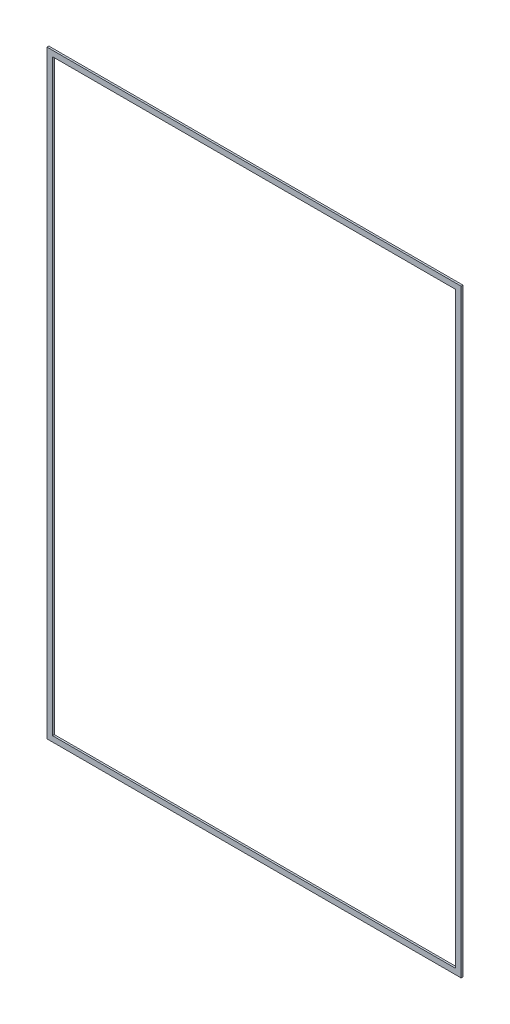
ISO-10303-21;
HEADER;
FILE_DESCRIPTION(('STEP AP214'),'2;1');
FILE_NAME('part.step','',(''),(''),'','','');
FILE_SCHEMA(('AUTOMOTIVE_DESIGN { 1 0 10303 214 1 1 1 1 }'));
ENDSEC;
DATA;
#1=APPLICATION_CONTEXT('core data for automotive mechanical design processes');
#2=APPLICATION_PROTOCOL_DEFINITION('international standard','automotive_design',2000,#1);
#3=PRODUCT_CONTEXT('',#1,'mechanical');
#4=PRODUCT('Part','Part','',(#3));
#5=PRODUCT_RELATED_PRODUCT_CATEGORY('part','',(#4));
#6=PRODUCT_DEFINITION_FORMATION('','',#4);
#7=PRODUCT_DEFINITION_CONTEXT('part definition',#1,'design');
#8=PRODUCT_DEFINITION('design','',#6,#7);
#9=PRODUCT_DEFINITION_SHAPE('','',#8);
#10=(LENGTH_UNIT() NAMED_UNIT(*) SI_UNIT(.MILLI.,.METRE.));
#11=(NAMED_UNIT(*) PLANE_ANGLE_UNIT() SI_UNIT($,.RADIAN.));
#12=(NAMED_UNIT(*) SI_UNIT($,.STERADIAN.) SOLID_ANGLE_UNIT());
#13=UNCERTAINTY_MEASURE_WITH_UNIT(LENGTH_MEASURE(1.E-05),#10,'distance_accuracy_value','');
#14=(GEOMETRIC_REPRESENTATION_CONTEXT(3) GLOBAL_UNCERTAINTY_ASSIGNED_CONTEXT((#13)) GLOBAL_UNIT_ASSIGNED_CONTEXT((#10,
#11,#12)) REPRESENTATION_CONTEXT('',''));
#15=CARTESIAN_POINT('',(0.,0.,0.));
#16=DIRECTION('',(0.,0.,1.));
#17=DIRECTION('',(1.,0.,0.));
#18=AXIS2_PLACEMENT_3D('',#15,#16,#17);
#19=CARTESIAN_POINT('',(0.,0.,1.));
#20=DIRECTION('',(0.,0.,-1.));
#21=DIRECTION('',(-1.,0.,0.));
#22=AXIS2_PLACEMENT_3D('',#19,#20,#21);
#23=PLANE('',#22);
#24=DIRECTION('',(0.,-1.,0.));
#25=VECTOR('',#24,1.);
#26=CARTESIAN_POINT('',(0.,0.,1.));
#27=LINE('',#26,#25);
#28=CARTESIAN_POINT('',(0.,324.,1.));
#29=VERTEX_POINT('',#28);
#30=CARTESIAN_POINT('',(0.,0.,1.));
#31=VERTEX_POINT('',#30);
#32=EDGE_CURVE('E143',#29,#31,#27,.T.);
#33=ORIENTED_EDGE('',*,*,#32,.T.);
#34=DIRECTION('',(1.,0.,0.));
#35=VECTOR('',#34,1.);
#36=CARTESIAN_POINT('',(0.,0.,1.));
#37=LINE('',#36,#35);
#38=CARTESIAN_POINT('',(224.,0.,1.));
#39=VERTEX_POINT('',#38);
#40=EDGE_CURVE('E150',#31,#39,#37,.T.);
#41=ORIENTED_EDGE('',*,*,#40,.T.);
#42=DIRECTION('',(0.,1.,0.));
#43=VECTOR('',#42,1.);
#44=CARTESIAN_POINT('',(224.,0.,1.));
#45=LINE('',#44,#43);
#46=CARTESIAN_POINT('',(224.,324.,1.));
#47=VERTEX_POINT('',#46);
#48=EDGE_CURVE('E148',#39,#47,#45,.T.);
#49=ORIENTED_EDGE('',*,*,#48,.T.);
#50=DIRECTION('',(-1.,0.,0.));
#51=VECTOR('',#50,1.);
#52=CARTESIAN_POINT('',(0.,324.,1.));
#53=LINE('',#52,#51);
#54=EDGE_CURVE('E155',#47,#29,#53,.T.);
#55=ORIENTED_EDGE('',*,*,#54,.T.);
#56=EDGE_LOOP('',(#33,#41,#49,#55));
#57=FACE_BOUND('',#56,.T.);
#58=DIRECTION('',(0.,-1.,0.));
#59=VECTOR('',#58,1.);
#60=CARTESIAN_POINT('',(3.,3.,1.));
#61=LINE('',#60,#59);
#62=CARTESIAN_POINT('',(3.,321.,1.));
#63=VERTEX_POINT('',#62);
#64=CARTESIAN_POINT('',(3.,3.,1.));
#65=VERTEX_POINT('',#64);
#66=EDGE_CURVE('E106',#63,#65,#61,.T.);
#67=ORIENTED_EDGE('',*,*,#66,.F.);
#68=DIRECTION('',(-1.,0.,0.));
#69=VECTOR('',#68,1.);
#70=CARTESIAN_POINT('',(3.,321.,1.));
#71=LINE('',#70,#69);
#72=CARTESIAN_POINT('',(221.,321.,1.));
#73=VERTEX_POINT('',#72);
#74=EDGE_CURVE('E127',#73,#63,#71,.T.);
#75=ORIENTED_EDGE('',*,*,#74,.F.);
#76=DIRECTION('',(0.,1.,0.));
#77=VECTOR('',#76,1.);
#78=CARTESIAN_POINT('',(221.,3.,1.));
#79=LINE('',#78,#77);
#80=CARTESIAN_POINT('',(221.,3.,1.));
#81=VERTEX_POINT('',#80);
#82=EDGE_CURVE('E126',#81,#73,#79,.T.);
#83=ORIENTED_EDGE('',*,*,#82,.F.);
#84=DIRECTION('',(1.,0.,0.));
#85=VECTOR('',#84,1.);
#86=CARTESIAN_POINT('',(3.,3.,1.));
#87=LINE('',#86,#85);
#88=EDGE_CURVE('E116',#65,#81,#87,.T.);
#89=ORIENTED_EDGE('',*,*,#88,.F.);
#90=EDGE_LOOP('',(#67,#75,#83,#89));
#91=FACE_BOUND('',#90,.T.);
#92=ADVANCED_FACE('F43',(#57,#91),#23,.F.);
#93=CARTESIAN_POINT('',(0.,0.,0.));
#94=DIRECTION('',(0.,0.,-1.));
#95=DIRECTION('',(-1.,0.,0.));
#96=AXIS2_PLACEMENT_3D('',#93,#94,#95);
#97=PLANE('',#96);
#98=DIRECTION('',(0.,-1.,0.));
#99=VECTOR('',#98,1.);
#100=CARTESIAN_POINT('',(0.,0.,0.));
#101=LINE('',#100,#99);
#102=CARTESIAN_POINT('',(0.,324.,0.));
#103=VERTEX_POINT('',#102);
#104=CARTESIAN_POINT('',(0.,0.,0.));
#105=VERTEX_POINT('',#104);
#106=EDGE_CURVE('E125',#103,#105,#101,.T.);
#107=ORIENTED_EDGE('',*,*,#106,.F.);
#108=DIRECTION('',(-1.,0.,0.));
#109=VECTOR('',#108,1.);
#110=CARTESIAN_POINT('',(0.,324.,0.));
#111=LINE('',#110,#109);
#112=CARTESIAN_POINT('',(224.,324.,0.));
#113=VERTEX_POINT('',#112);
#114=EDGE_CURVE('E149',#113,#103,#111,.T.);
#115=ORIENTED_EDGE('',*,*,#114,.F.);
#116=DIRECTION('',(0.,1.,0.));
#117=VECTOR('',#116,1.);
#118=CARTESIAN_POINT('',(224.,0.,0.));
#119=LINE('',#118,#117);
#120=CARTESIAN_POINT('',(224.,0.,0.));
#121=VERTEX_POINT('',#120);
#122=EDGE_CURVE('E159',#121,#113,#119,.T.);
#123=ORIENTED_EDGE('',*,*,#122,.F.);
#124=DIRECTION('',(1.,0.,0.));
#125=VECTOR('',#124,1.);
#126=CARTESIAN_POINT('',(0.,0.,0.));
#127=LINE('',#126,#125);
#128=EDGE_CURVE('E160',#105,#121,#127,.T.);
#129=ORIENTED_EDGE('',*,*,#128,.F.);
#130=EDGE_LOOP('',(#107,#115,#123,#129));
#131=FACE_BOUND('',#130,.T.);
#132=DIRECTION('',(-1.,0.,0.));
#133=VECTOR('',#132,1.);
#134=CARTESIAN_POINT('',(3.,321.,0.));
#135=LINE('',#134,#133);
#136=CARTESIAN_POINT('',(221.,321.,0.));
#137=VERTEX_POINT('',#136);
#138=CARTESIAN_POINT('',(3.,321.,0.));
#139=VERTEX_POINT('',#138);
#140=EDGE_CURVE('E117',#137,#139,#135,.T.);
#141=ORIENTED_EDGE('',*,*,#140,.T.);
#142=DIRECTION('',(0.,-1.,0.));
#143=VECTOR('',#142,1.);
#144=CARTESIAN_POINT('',(3.,3.,0.));
#145=LINE('',#144,#143);
#146=CARTESIAN_POINT('',(3.,3.,0.));
#147=VERTEX_POINT('',#146);
#148=EDGE_CURVE('E67',#139,#147,#145,.T.);
#149=ORIENTED_EDGE('',*,*,#148,.T.);
#150=DIRECTION('',(1.,0.,0.));
#151=VECTOR('',#150,1.);
#152=CARTESIAN_POINT('',(3.,3.,0.));
#153=LINE('',#152,#151);
#154=CARTESIAN_POINT('',(221.,3.,0.));
#155=VERTEX_POINT('',#154);
#156=EDGE_CURVE('E121',#147,#155,#153,.T.);
#157=ORIENTED_EDGE('',*,*,#156,.T.);
#158=DIRECTION('',(0.,1.,0.));
#159=VECTOR('',#158,1.);
#160=CARTESIAN_POINT('',(221.,3.,0.));
#161=LINE('',#160,#159);
#162=EDGE_CURVE('E136',#155,#137,#161,.T.);
#163=ORIENTED_EDGE('',*,*,#162,.T.);
#164=EDGE_LOOP('',(#141,#149,#157,#163));
#165=FACE_BOUND('',#164,.T.);
#166=ADVANCED_FACE('F180',(#131,#165),#97,.T.);
#167=CARTESIAN_POINT('',(0.,0.,1.));
#168=DIRECTION('',(1.,0.,0.));
#169=DIRECTION('',(0.,0.,-1.));
#170=AXIS2_PLACEMENT_3D('',#167,#168,#169);
#171=PLANE('',#170);
#172=ORIENTED_EDGE('',*,*,#106,.T.);
#173=DIRECTION('',(0.,0.,-1.));
#174=VECTOR('',#173,1.);
#175=CARTESIAN_POINT('',(0.,0.,1.));
#176=LINE('',#175,#174);
#177=EDGE_CURVE('E11',#31,#105,#176,.T.);
#178=ORIENTED_EDGE('',*,*,#177,.F.);
#179=ORIENTED_EDGE('',*,*,#32,.F.);
#180=DIRECTION('',(0.,0.,-1.));
#181=VECTOR('',#180,1.);
#182=CARTESIAN_POINT('',(0.,324.,1.));
#183=LINE('',#182,#181);
#184=EDGE_CURVE('E154',#29,#103,#183,.T.);
#185=ORIENTED_EDGE('',*,*,#184,.T.);
#186=EDGE_LOOP('',(#172,#178,#179,#185));
#187=FACE_BOUND('',#186,.T.);
#188=ADVANCED_FACE('F44',(#187),#171,.F.);
#189=CARTESIAN_POINT('',(0.,0.,1.));
#190=DIRECTION('',(0.,1.,0.));
#191=DIRECTION('',(0.,0.,1.));
#192=AXIS2_PLACEMENT_3D('',#189,#190,#191);
#193=PLANE('',#192);
#194=ORIENTED_EDGE('',*,*,#128,.T.);
#195=DIRECTION('',(0.,0.,-1.));
#196=VECTOR('',#195,1.);
#197=CARTESIAN_POINT('',(224.,0.,1.));
#198=LINE('',#197,#196);
#199=EDGE_CURVE('E51',#39,#121,#198,.T.);
#200=ORIENTED_EDGE('',*,*,#199,.F.);
#201=ORIENTED_EDGE('',*,*,#40,.F.);
#202=ORIENTED_EDGE('',*,*,#177,.T.);
#203=EDGE_LOOP('',(#194,#200,#201,#202));
#204=FACE_BOUND('',#203,.T.);
#205=ADVANCED_FACE('F190',(#204),#193,.F.);
#206=CARTESIAN_POINT('',(224.,0.,1.));
#207=DIRECTION('',(-1.,0.,0.));
#208=DIRECTION('',(0.,0.,1.));
#209=AXIS2_PLACEMENT_3D('',#206,#207,#208);
#210=PLANE('',#209);
#211=ORIENTED_EDGE('',*,*,#122,.T.);
#212=DIRECTION('',(0.,0.,-1.));
#213=VECTOR('',#212,1.);
#214=CARTESIAN_POINT('',(224.,324.,1.));
#215=LINE('',#214,#213);
#216=EDGE_CURVE('E163',#47,#113,#215,.T.);
#217=ORIENTED_EDGE('',*,*,#216,.F.);
#218=ORIENTED_EDGE('',*,*,#48,.F.);
#219=ORIENTED_EDGE('',*,*,#199,.T.);
#220=EDGE_LOOP('',(#211,#217,#218,#219));
#221=FACE_BOUND('',#220,.T.);
#222=ADVANCED_FACE('F173',(#221),#210,.F.);
#223=CARTESIAN_POINT('',(0.,324.,1.));
#224=DIRECTION('',(0.,-1.,0.));
#225=DIRECTION('',(0.,0.,-1.));
#226=AXIS2_PLACEMENT_3D('',#223,#224,#225);
#227=PLANE('',#226);
#228=ORIENTED_EDGE('',*,*,#114,.T.);
#229=ORIENTED_EDGE('',*,*,#184,.F.);
#230=ORIENTED_EDGE('',*,*,#54,.F.);
#231=ORIENTED_EDGE('',*,*,#216,.T.);
#232=EDGE_LOOP('',(#228,#229,#230,#231));
#233=FACE_BOUND('',#232,.T.);
#234=ADVANCED_FACE('F181',(#233),#227,.F.);
#235=CARTESIAN_POINT('',(3.,3.,1.));
#236=DIRECTION('',(1.,0.,0.));
#237=DIRECTION('',(0.,0.,-1.));
#238=AXIS2_PLACEMENT_3D('',#235,#236,#237);
#239=PLANE('',#238);
#240=ORIENTED_EDGE('',*,*,#148,.F.);
#241=DIRECTION('',(0.,0.,-1.));
#242=VECTOR('',#241,1.);
#243=CARTESIAN_POINT('',(3.,321.,1.));
#244=LINE('',#243,#242);
#245=EDGE_CURVE('E115',#63,#139,#244,.T.);
#246=ORIENTED_EDGE('',*,*,#245,.F.);
#247=ORIENTED_EDGE('',*,*,#66,.T.);
#248=DIRECTION('',(0.,0.,-1.));
#249=VECTOR('',#248,1.);
#250=CARTESIAN_POINT('',(3.,3.,1.));
#251=LINE('',#250,#249);
#252=EDGE_CURVE('E112',#65,#147,#251,.T.);
#253=ORIENTED_EDGE('',*,*,#252,.T.);
#254=EDGE_LOOP('',(#240,#246,#247,#253));
#255=FACE_BOUND('',#254,.T.);
#256=ADVANCED_FACE('F107',(#255),#239,.T.);
#257=CARTESIAN_POINT('',(3.,3.,1.));
#258=DIRECTION('',(0.,1.,0.));
#259=DIRECTION('',(0.,0.,1.));
#260=AXIS2_PLACEMENT_3D('',#257,#258,#259);
#261=PLANE('',#260);
#262=ORIENTED_EDGE('',*,*,#156,.F.);
#263=ORIENTED_EDGE('',*,*,#252,.F.);
#264=ORIENTED_EDGE('',*,*,#88,.T.);
#265=DIRECTION('',(0.,0.,-1.));
#266=VECTOR('',#265,1.);
#267=CARTESIAN_POINT('',(221.,3.,1.));
#268=LINE('',#267,#266);
#269=EDGE_CURVE('E124',#81,#155,#268,.T.);
#270=ORIENTED_EDGE('',*,*,#269,.T.);
#271=EDGE_LOOP('',(#262,#263,#264,#270));
#272=FACE_BOUND('',#271,.T.);
#273=ADVANCED_FACE('F120',(#272),#261,.T.);
#274=CARTESIAN_POINT('',(221.,3.,1.));
#275=DIRECTION('',(-1.,0.,0.));
#276=DIRECTION('',(0.,0.,1.));
#277=AXIS2_PLACEMENT_3D('',#274,#275,#276);
#278=PLANE('',#277);
#279=ORIENTED_EDGE('',*,*,#162,.F.);
#280=ORIENTED_EDGE('',*,*,#269,.F.);
#281=ORIENTED_EDGE('',*,*,#82,.T.);
#282=DIRECTION('',(0.,0.,-1.));
#283=VECTOR('',#282,1.);
#284=CARTESIAN_POINT('',(221.,321.,1.));
#285=LINE('',#284,#283);
#286=EDGE_CURVE('E59',#73,#137,#285,.T.);
#287=ORIENTED_EDGE('',*,*,#286,.T.);
#288=EDGE_LOOP('',(#279,#280,#281,#287));
#289=FACE_BOUND('',#288,.T.);
#290=ADVANCED_FACE('F210',(#289),#278,.T.);
#291=CARTESIAN_POINT('',(3.,321.,1.));
#292=DIRECTION('',(0.,-1.,0.));
#293=DIRECTION('',(0.,0.,-1.));
#294=AXIS2_PLACEMENT_3D('',#291,#292,#293);
#295=PLANE('',#294);
#296=ORIENTED_EDGE('',*,*,#140,.F.);
#297=ORIENTED_EDGE('',*,*,#286,.F.);
#298=ORIENTED_EDGE('',*,*,#74,.T.);
#299=ORIENTED_EDGE('',*,*,#245,.T.);
#300=EDGE_LOOP('',(#296,#297,#298,#299));
#301=FACE_BOUND('',#300,.T.);
#302=ADVANCED_FACE('F215',(#301),#295,.T.);
#303=CLOSED_SHELL('',(#92,#166,#188,#205,#222,#234,#256,#273,#290,#302));
#304=MANIFOLD_SOLID_BREP('B2',#303);
#305=ADVANCED_BREP_SHAPE_REPRESENTATION('',(#18,#304),#14);
#306=SHAPE_DEFINITION_REPRESENTATION(#9,#305);
ENDSEC;
END-ISO-10303-21;
